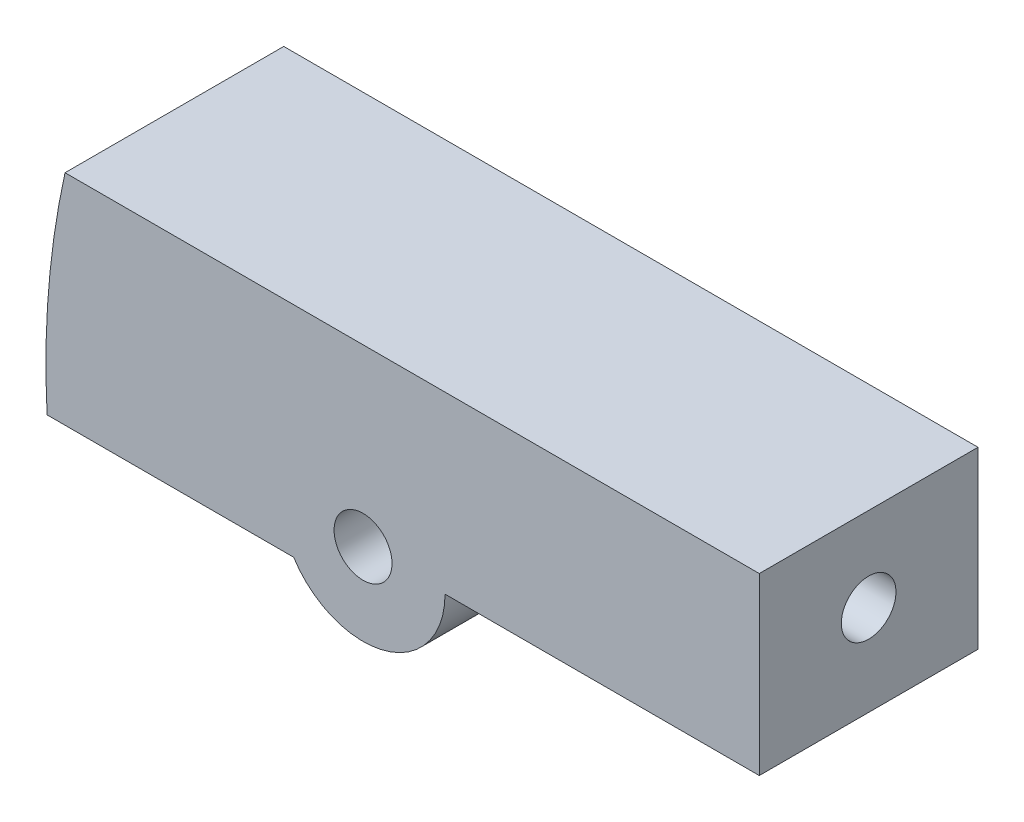
ISO-10303-21;
HEADER;
FILE_DESCRIPTION(('STEP AP214'),'2;1');
FILE_NAME('part.step','',(''),(''),'','','');
FILE_SCHEMA(('AUTOMOTIVE_DESIGN { 1 0 10303 214 1 1 1 1 }'));
ENDSEC;
DATA;
#1=APPLICATION_CONTEXT('core data for automotive mechanical design processes');
#2=APPLICATION_PROTOCOL_DEFINITION('international standard','automotive_design',2000,#1);
#3=PRODUCT_CONTEXT('',#1,'mechanical');
#4=PRODUCT('Part','Part','',(#3));
#5=PRODUCT_RELATED_PRODUCT_CATEGORY('part','',(#4));
#6=PRODUCT_DEFINITION_FORMATION('','',#4);
#7=PRODUCT_DEFINITION_CONTEXT('part definition',#1,'design');
#8=PRODUCT_DEFINITION('design','',#6,#7);
#9=PRODUCT_DEFINITION_SHAPE('','',#8);
#10=(LENGTH_UNIT() NAMED_UNIT(*) SI_UNIT(.MILLI.,.METRE.));
#11=(NAMED_UNIT(*) PLANE_ANGLE_UNIT() SI_UNIT($,.RADIAN.));
#12=(NAMED_UNIT(*) SI_UNIT($,.STERADIAN.) SOLID_ANGLE_UNIT());
#13=UNCERTAINTY_MEASURE_WITH_UNIT(LENGTH_MEASURE(1.E-05),#10,'distance_accuracy_value','');
#14=(GEOMETRIC_REPRESENTATION_CONTEXT(3) GLOBAL_UNCERTAINTY_ASSIGNED_CONTEXT((#13)) GLOBAL_UNIT_ASSIGNED_CONTEXT((#10,
#11,#12)) REPRESENTATION_CONTEXT('',''));
#15=CARTESIAN_POINT('',(0.,0.,0.));
#16=DIRECTION('',(0.,0.,1.));
#17=DIRECTION('',(1.,0.,0.));
#18=AXIS2_PLACEMENT_3D('',#15,#16,#17);
#19=CARTESIAN_POINT('',(0.,-4.00000000000001,10.));
#20=DIRECTION('',(0.,1.,0.));
#21=DIRECTION('',(0.,0.,1.));
#22=AXIS2_PLACEMENT_3D('',#19,#20,#21);
#23=PLANE('',#22);
#24=DIRECTION('',(0.,0.,-1.));
#25=VECTOR('',#24,1.);
#26=CARTESIAN_POINT('',(-73.8918128076447,-4.00000000000001,10.));
#27=LINE('',#26,#25);
#28=CARTESIAN_POINT('',(-73.8918128076447,-4.00000000000001,-10.));
#29=VERTEX_POINT('',#28);
#30=CARTESIAN_POINT('',(-73.8918128076447,-4.00000000000001,10.));
#31=VERTEX_POINT('',#30);
#32=EDGE_CURVE('E161',#29,#31,#27,.F.);
#33=ORIENTED_EDGE('',*,*,#32,.F.);
#34=DIRECTION('',(1.,0.,0.));
#35=VECTOR('',#34,1.);
#36=CARTESIAN_POINT('',(0.,-4.00000000000001,-10.));
#37=LINE('',#36,#35);
#38=CARTESIAN_POINT('',(-51.3442887702248,-4.00000000000001,-10.));
#39=VERTEX_POINT('',#38);
#40=EDGE_CURVE('E119',#29,#39,#37,.T.);
#41=ORIENTED_EDGE('',*,*,#40,.T.);
#42=DIRECTION('',(0.,0.,-1.));
#43=VECTOR('',#42,1.);
#44=CARTESIAN_POINT('',(-51.3442887702248,-4.00000000000001,10.));
#45=LINE('',#44,#43);
#46=CARTESIAN_POINT('',(-51.3442887702248,-4.00000000000001,10.));
#47=VERTEX_POINT('',#46);
#48=EDGE_CURVE('E11',#47,#39,#45,.T.);
#49=ORIENTED_EDGE('',*,*,#48,.F.);
#50=DIRECTION('',(1.,0.,0.));
#51=VECTOR('',#50,1.);
#52=CARTESIAN_POINT('',(0.,-4.00000000000001,10.));
#53=LINE('',#52,#51);
#54=EDGE_CURVE('E131',#31,#47,#53,.T.);
#55=ORIENTED_EDGE('',*,*,#54,.F.);
#56=EDGE_LOOP('',(#33,#41,#49,#55));
#57=FACE_BOUND('',#56,.T.);
#58=ADVANCED_FACE('F38',(#57),#23,.F.);
#59=CARTESIAN_POINT('',(0.,16.,10.));
#60=DIRECTION('',(0.,-1.,0.));
#61=DIRECTION('',(0.,0.,-1.));
#62=AXIS2_PLACEMENT_3D('',#59,#60,#61);
#63=PLANE('',#62);
#64=DIRECTION('',(-1.,0.,0.));
#65=VECTOR('',#64,1.);
#66=CARTESIAN_POINT('',(0.,16.,10.));
#67=LINE('',#66,#65);
#68=CARTESIAN_POINT('',(-8.7639577987509,16.,10.));
#69=VERTEX_POINT('',#68);
#70=CARTESIAN_POINT('',(-72.2495674727538,16.,10.));
#71=VERTEX_POINT('',#70);
#72=EDGE_CURVE('E104',#69,#71,#67,.T.);
#73=ORIENTED_EDGE('',*,*,#72,.F.);
#74=DIRECTION('',(0.,0.,-1.));
#75=VECTOR('',#74,1.);
#76=CARTESIAN_POINT('',(-8.7639577987509,16.,10.));
#77=LINE('',#76,#75);
#78=CARTESIAN_POINT('',(-8.7639577987509,16.,-10.));
#79=VERTEX_POINT('',#78);
#80=EDGE_CURVE('E91',#69,#79,#77,.T.);
#81=ORIENTED_EDGE('',*,*,#80,.T.);
#82=DIRECTION('',(-1.,0.,0.));
#83=VECTOR('',#82,1.);
#84=CARTESIAN_POINT('',(0.,16.,-10.));
#85=LINE('',#84,#83);
#86=CARTESIAN_POINT('',(-72.2495674727538,16.,-10.));
#87=VERTEX_POINT('',#86);
#88=EDGE_CURVE('E62',#79,#87,#85,.T.);
#89=ORIENTED_EDGE('',*,*,#88,.T.);
#90=DIRECTION('',(0.,0.,-1.));
#91=VECTOR('',#90,1.);
#92=CARTESIAN_POINT('',(-72.2495674727538,16.,10.));
#93=LINE('',#92,#91);
#94=EDGE_CURVE('E110',#71,#87,#93,.T.);
#95=ORIENTED_EDGE('',*,*,#94,.F.);
#96=EDGE_LOOP('',(#73,#81,#89,#95));
#97=FACE_BOUND('',#96,.T.);
#98=ADVANCED_FACE('F109',(#97),#63,.F.);
#99=CARTESIAN_POINT('',(0.,0.,10.));
#100=DIRECTION('',(0.,0.,1.));
#101=DIRECTION('',(1.,0.,0.));
#102=AXIS2_PLACEMENT_3D('',#99,#100,#101);
#103=PLANE('',#102);
#104=DIRECTION('',(0.,1.,0.));
#105=VECTOR('',#104,1.);
#106=CARTESIAN_POINT('',(-8.7639577987509,0.,10.));
#107=LINE('',#106,#105);
#108=CARTESIAN_POINT('',(-8.7639577987509,0.,10.));
#109=VERTEX_POINT('',#108);
#110=EDGE_CURVE('E54',#109,#69,#107,.T.);
#111=ORIENTED_EDGE('',*,*,#110,.T.);
#112=ORIENTED_EDGE('',*,*,#72,.T.);
#113=CARTESIAN_POINT('',(0.,0.,10.));
#114=DIRECTION('',(0.,0.,-1.));
#115=DIRECTION('',(-1.,0.,0.));
#116=AXIS2_PLACEMENT_3D('',#113,#114,#115);
#117=CIRCLE('',#116,74.);
#118=EDGE_CURVE('E140',#31,#71,#117,.T.);
#119=ORIENTED_EDGE('',*,*,#118,.F.);
#120=ORIENTED_EDGE('',*,*,#54,.T.);
#121=CARTESIAN_POINT('',(-45.,0.,10.));
#122=DIRECTION('',(0.,0.,1.));
#123=DIRECTION('',(1.,0.,0.));
#124=AXIS2_PLACEMENT_3D('',#121,#122,#123);
#125=CIRCLE('',#124,7.5);
#126=CARTESIAN_POINT('',(-37.5,0.,10.));
#127=VERTEX_POINT('',#126);
#128=EDGE_CURVE('E115',#47,#127,#125,.T.);
#129=ORIENTED_EDGE('',*,*,#128,.T.);
#130=DIRECTION('',(1.,0.,0.));
#131=VECTOR('',#130,1.);
#132=CARTESIAN_POINT('',(0.,0.,10.));
#133=LINE('',#132,#131);
#134=EDGE_CURVE('E107',#127,#109,#133,.T.);
#135=ORIENTED_EDGE('',*,*,#134,.T.);
#136=EDGE_LOOP('',(#111,#112,#119,#120,#129,#135));
#137=FACE_BOUND('',#136,.T.);
#138=CARTESIAN_POINT('',(-45.,0.,10.));
#139=DIRECTION('',(0.,0.,1.));
#140=DIRECTION('',(1.,0.,0.));
#141=AXIS2_PLACEMENT_3D('',#138,#139,#140);
#142=CIRCLE('',#141,2.65);
#143=CARTESIAN_POINT('',(-42.35,0.,10.));
#144=VERTEX_POINT('',#143);
#145=EDGE_CURVE('E111',#144,#144,#142,.T.);
#146=ORIENTED_EDGE('',*,*,#145,.F.);
#147=EDGE_LOOP('',(#146));
#148=FACE_BOUND('',#147,.T.);
#149=ADVANCED_FACE('F101',(#137,#148),#103,.T.);
#150=CARTESIAN_POINT('',(0.,0.,-10.));
#151=DIRECTION('',(0.,0.,1.));
#152=DIRECTION('',(1.,0.,0.));
#153=AXIS2_PLACEMENT_3D('',#150,#151,#152);
#154=PLANE('',#153);
#155=CARTESIAN_POINT('',(-45.,0.,-10.));
#156=DIRECTION('',(0.,0.,1.));
#157=DIRECTION('',(1.,0.,0.));
#158=AXIS2_PLACEMENT_3D('',#155,#156,#157);
#159=CIRCLE('',#158,2.65);
#160=CARTESIAN_POINT('',(-42.35,0.,-10.));
#161=VERTEX_POINT('',#160);
#162=EDGE_CURVE('E128',#161,#161,#159,.T.);
#163=ORIENTED_EDGE('',*,*,#162,.T.);
#164=EDGE_LOOP('',(#163));
#165=FACE_BOUND('',#164,.T.);
#166=ORIENTED_EDGE('',*,*,#88,.F.);
#167=DIRECTION('',(0.,1.,0.));
#168=VECTOR('',#167,1.);
#169=CARTESIAN_POINT('',(-8.7639577987509,0.,-10.));
#170=LINE('',#169,#168);
#171=CARTESIAN_POINT('',(-8.7639577987509,0.,-10.));
#172=VERTEX_POINT('',#171);
#173=EDGE_CURVE('E95',#172,#79,#170,.T.);
#174=ORIENTED_EDGE('',*,*,#173,.F.);
#175=DIRECTION('',(1.,0.,0.));
#176=VECTOR('',#175,1.);
#177=CARTESIAN_POINT('',(0.,0.,-10.));
#178=LINE('',#177,#176);
#179=CARTESIAN_POINT('',(-37.5,0.,-10.));
#180=VERTEX_POINT('',#179);
#181=EDGE_CURVE('E124',#180,#172,#178,.T.);
#182=ORIENTED_EDGE('',*,*,#181,.F.);
#183=CARTESIAN_POINT('',(-45.,0.,-10.));
#184=DIRECTION('',(0.,0.,1.));
#185=DIRECTION('',(1.,0.,0.));
#186=AXIS2_PLACEMENT_3D('',#183,#184,#185);
#187=CIRCLE('',#186,7.5);
#188=EDGE_CURVE('E121',#39,#180,#187,.T.);
#189=ORIENTED_EDGE('',*,*,#188,.F.);
#190=ORIENTED_EDGE('',*,*,#40,.F.);
#191=CARTESIAN_POINT('',(0.,0.,-10.));
#192=DIRECTION('',(0.,0.,-1.));
#193=DIRECTION('',(-1.,0.,0.));
#194=AXIS2_PLACEMENT_3D('',#191,#192,#193);
#195=CIRCLE('',#194,74.);
#196=EDGE_CURVE('E171',#29,#87,#195,.T.);
#197=ORIENTED_EDGE('',*,*,#196,.T.);
#198=EDGE_LOOP('',(#166,#174,#182,#189,#190,#197));
#199=FACE_BOUND('',#198,.T.);
#200=ADVANCED_FACE('F170',(#165,#199),#154,.F.);
#201=CARTESIAN_POINT('',(-70.2436043793756,8.3,0.));
#202=DIRECTION('',(-1.,0.,0.));
#203=DIRECTION('',(0.,0.,1.));
#204=AXIS2_PLACEMENT_3D('',#201,#202,#203);
#205=CONICAL_SURFACE('',#204,5.,0.463647609000806);
#206=CARTESIAN_POINT('',(-70.2436043793756,8.3,0.));
#207=DIRECTION('',(-1.,0.,0.));
#208=DIRECTION('',(0.,0.,1.));
#209=AXIS2_PLACEMENT_3D('',#206,#207,#208);
#210=CIRCLE('',#209,5.);
#211=CARTESIAN_POINT('',(-70.2436043793756,8.3,5.));
#212=VERTEX_POINT('',#211);
#213=EDGE_CURVE('E166',#212,#212,#210,.T.);
#214=ORIENTED_EDGE('',*,*,#213,.F.);
#215=EDGE_LOOP('',(#214));
#216=FACE_BOUND('',#215,.T.);
#217=CARTESIAN_POINT('',(-73.9208250030032,3.42222856590751,-4.79311329172754));
#218=CARTESIAN_POINT('',(-73.927455676223,3.27900552676786,-4.65209047552909));
#219=CARTESIAN_POINT('',(-73.9333700677521,3.14223725698298,-4.50447694520476));
#220=CARTESIAN_POINT('',(-73.9439469878067,2.88263622392718,-4.19731638967341));
#221=CARTESIAN_POINT('',(-73.9486089502586,2.75980977652413,-4.03776400985305));
#222=CARTESIAN_POINT('',(-73.956864140095,2.52895472577176,-3.70796102563179));
#223=CARTESIAN_POINT('',(-73.9604559756042,2.42094549224557,-3.53769683417333));
#224=CARTESIAN_POINT('',(-73.9667399778516,2.22068109353439,-3.18803952709168));
#225=CARTESIAN_POINT('',(-73.9694318026984,2.128431921695,-3.00864297206272));
#226=CARTESIAN_POINT('',(-73.9739037865618,1.9666252751813,-2.65583859145309));
#227=CARTESIAN_POINT('',(-73.9757366164715,1.89589468660634,-2.48296789741234));
#228=CARTESIAN_POINT('',(-73.9788805704622,1.76897271536259,-2.13189679329858));
#229=CARTESIAN_POINT('',(-73.9801915204285,1.71278618720946,-1.95369462577034));
#230=CARTESIAN_POINT('',(-73.9823827625387,1.61536819991884,-1.59342275704418));
#231=CARTESIAN_POINT('',(-73.9832634467708,1.57412313397626,-1.411356735353));
#232=CARTESIAN_POINT('',(-73.9846663141089,1.50674724357851,-1.0443796014143));
#233=CARTESIAN_POINT('',(-73.9851883643301,1.48062202205105,-0.859467460511191));
#234=CARTESIAN_POINT('',(-73.9859257422696,1.44331201948869,-0.484591952088412));
#235=CARTESIAN_POINT('',(-73.9861350572726,1.43242036860439,-0.294599343560892));
#236=CARTESIAN_POINT('',(-73.9862478895074,1.42658034055793,0.0857009679514436));
#237=CARTESIAN_POINT('',(-73.9861512923211,1.43163792877076,0.276008762217751));
#238=CARTESIAN_POINT('',(-73.9856428597659,1.45767613837094,0.655495297328398));
#239=CARTESIAN_POINT('',(-73.9852310851561,1.4786536907443,0.844674248704919));
#240=CARTESIAN_POINT('',(-73.9840541882086,1.53641109997477,1.22067505683643));
#241=CARTESIAN_POINT('',(-73.9832889354756,1.5731967879757,1.40749601759819));
#242=CARTESIAN_POINT('',(-73.9813349448679,1.66255350724914,1.77824032137923));
#243=CARTESIAN_POINT('',(-73.9801442626754,1.71519683557402,1.96214624372067));
#244=CARTESIAN_POINT('',(-73.9772473758999,1.83589588518588,2.3248988564165));
#245=CARTESIAN_POINT('',(-73.9755409788103,1.90395735939002,2.50374363023082));
#246=CARTESIAN_POINT('',(-73.9714982565647,2.05503008622673,2.85492916008061));
#247=CARTESIAN_POINT('',(-73.9691621836708,2.13803534763375,3.02727248928793));
#248=CARTESIAN_POINT('',(-73.9637268967619,2.31845747924975,3.36425124641934));
#249=CARTESIAN_POINT('',(-73.9606274048362,2.4158795925218,3.52888384133737));
#250=CARTESIAN_POINT('',(-73.9500365052037,2.7266860167672,4.00592257379688));
#251=CARTESIAN_POINT('',(-73.9412136787813,2.96033169157717,4.30545995353136));
#252=CARTESIAN_POINT('',(-73.9187982496538,3.47526251045289,4.85982471586212));
#253=CARTESIAN_POINT('',(-73.9052062468609,3.75654166042737,5.11465771575443));
#254=CARTESIAN_POINT('',(-73.8724793862087,4.35244571853446,5.56688257137147));
#255=CARTESIAN_POINT('',(-73.8534672774451,4.66624369830599,5.7653710229704));
#256=CARTESIAN_POINT('',(-73.8090499156357,5.32280111725325,6.1055859172673));
#257=CARTESIAN_POINT('',(-73.7836455142603,5.66555669425572,6.24731991507244));
#258=CARTESIAN_POINT('',(-73.7267662350315,6.3626800483997,6.46733347278033));
#259=CARTESIAN_POINT('',(-73.6954248449066,6.71667161299089,6.54684102915377));
#260=CARTESIAN_POINT('',(-73.6266831453436,7.43240953461221,6.64485904978969));
#261=CARTESIAN_POINT('',(-73.5892831467255,7.79415549299936,6.66337264213665));
#262=CARTESIAN_POINT('',(-73.5096082012769,8.51278071820004,6.63924104102747));
#263=CARTESIAN_POINT('',(-73.4673645500759,8.86967622509269,6.5969701331704));
#264=CARTESIAN_POINT('',(-73.3792982629063,9.57097508408251,6.45359335164503));
#265=CARTESIAN_POINT('',(-73.3334754379,9.9153777749505,6.35248436856386));
#266=CARTESIAN_POINT('',(-73.2396536474501,10.5862769636153,6.0932344415436));
#267=CARTESIAN_POINT('',(-73.1916358028826,10.9125239736766,5.93445520212143));
#268=CARTESIAN_POINT('',(-73.096248398103,11.5341892837999,5.56487770941509));
#269=CARTESIAN_POINT('',(-73.0488789038736,11.8296044660798,5.35407420256103));
#270=CARTESIAN_POINT('',(-72.9564326674587,12.3871051498477,4.88209555553649));
#271=CARTESIAN_POINT('',(-72.9114146260858,12.6484721511774,4.6200599229229));
#272=CARTESIAN_POINT('',(-72.8272538611699,13.1243916334226,4.05563166888233));
#273=CARTESIAN_POINT('',(-72.788111509735,13.3389411497701,3.75323649376884));
#274=CARTESIAN_POINT('',(-72.7177180758931,13.7175472426624,3.11296428710339));
#275=CARTESIAN_POINT('',(-72.6865577570959,13.8810273355176,2.77473610626913));
#276=CARTESIAN_POINT('',(-72.6347334007632,14.1497117985555,2.07512110816519));
#277=CARTESIAN_POINT('',(-72.6140692360589,14.254916874785,1.71373457153601));
#278=CARTESIAN_POINT('',(-72.5846484453515,14.4039802348677,0.978414933793614));
#279=CARTESIAN_POINT('',(-72.5758802520301,14.4478981139104,0.604494383567873));
#280=CARTESIAN_POINT('',(-72.5708185696173,14.4733020939769,-0.145541250870023));
#281=CARTESIAN_POINT('',(-72.5745248187789,14.4547895049579,-0.521656288870685));
#282=CARTESIAN_POINT('',(-72.5941194025391,14.3560545529598,-1.26400972526993));
#283=CARTESIAN_POINT('',(-72.6099647915923,14.2760497324001,-1.63027824028581));
#284=CARTESIAN_POINT('',(-72.6527152444702,14.0568602652551,-2.3439911566334));
#285=CARTESIAN_POINT('',(-72.6796205654705,13.9176742425327,-2.69143512002702));
#286=CARTESIAN_POINT('',(-72.7427843503267,13.5836738749838,-3.35849151272348));
#287=CARTESIAN_POINT('',(-72.7790642794538,13.3887317530891,-3.67803778736043));
#288=CARTESIAN_POINT('',(-72.858676161744,12.9484768928227,-4.2796050010972));
#289=CARTESIAN_POINT('',(-72.9020083965779,12.7031621424544,-4.56162444054869));
#290=CARTESIAN_POINT('',(-72.9703324776783,12.3024018989965,-4.95055796340287));
#291=CARTESIAN_POINT('',(-72.9937117425104,12.1630376136135,-5.0747345795364));
#292=CARTESIAN_POINT('',(-73.0412320602965,11.874333052427,-5.31069796275349));
#293=CARTESIAN_POINT('',(-73.0653728224116,11.724996561545,-5.42248938824177));
#294=CARTESIAN_POINT('',(-73.1140854245178,11.4173020857442,-5.63288258059459));
#295=CARTESIAN_POINT('',(-73.138657420766,11.2589407819559,-5.73147944995433));
#296=CARTESIAN_POINT('',(-73.1878810983889,10.9343943665452,-5.91465048850972));
#297=CARTESIAN_POINT('',(-73.2125327448917,10.7682123349095,-5.9992301196601));
#298=CARTESIAN_POINT('',(-73.2614278836494,10.4303456188821,-6.15318053265259));
#299=CARTESIAN_POINT('',(-73.2856730331787,10.2587086650945,-6.22265554009587));
#300=CARTESIAN_POINT('',(-73.3336284019388,9.91009017586471,-6.34656248453261));
#301=CARTESIAN_POINT('',(-73.3573388283053,9.73311077428739,-6.40100034169141));
#302=CARTESIAN_POINT('',(-73.403968997886,9.37496409398067,-6.49441089301656));
#303=CARTESIAN_POINT('',(-73.4268885388917,9.19379576373877,-6.53337965850721));
#304=CARTESIAN_POINT('',(-73.4716797963158,8.82870742185639,-6.59546124092518));
#305=CARTESIAN_POINT('',(-73.4935519278274,8.64478853883585,-6.61858038831752));
#306=CARTESIAN_POINT('',(-73.5356730705991,8.27877512809782,-6.64848310838499));
#307=CARTESIAN_POINT('',(-73.5559440064084,8.09670619322032,-6.65554944981485));
#308=CARTESIAN_POINT('',(-73.5951161441694,7.73255457812772,-6.65407878724434));
#309=CARTESIAN_POINT('',(-73.6140178835077,7.55047193169169,-6.64554793975382));
#310=CARTESIAN_POINT('',(-73.650348584391,7.18745088062327,-6.61291020229587));
#311=CARTESIAN_POINT('',(-73.6677766766478,7.00651320881555,-6.58879419030522));
#312=CARTESIAN_POINT('',(-73.7010583888912,6.64729400492571,-6.52514519860433));
#313=CARTESIAN_POINT('',(-73.7169126062997,6.46901148699348,-6.48561809703158));
#314=CARTESIAN_POINT('',(-73.746808013733,6.11872486385843,-6.3920678154213));
#315=CARTESIAN_POINT('',(-73.7608707259052,5.94666856041678,-6.338246814265));
#316=CARTESIAN_POINT('',(-73.7874186830245,5.60765065366803,-6.21629925080905));
#317=CARTESIAN_POINT('',(-73.7999045148146,5.44068717269445,-6.14817803567308));
#318=CARTESIAN_POINT('',(-73.8233204248888,5.11314903604227,-5.9982101927412));
#319=CARTESIAN_POINT('',(-73.8342521705054,4.95256766854598,-5.91637848311146));
#320=CARTESIAN_POINT('',(-73.8546307477812,4.63877542547184,-5.7395855544747));
#321=CARTESIAN_POINT('',(-73.8640780257665,4.48556234416593,-5.64462829805069));
#322=CARTESIAN_POINT('',(-73.8824098230116,4.17327881827797,-5.43261702377971));
#323=CARTESIAN_POINT('',(-73.8911548151189,4.01504260259046,-5.31431943403066));
#324=CARTESIAN_POINT('',(-73.9071054271562,3.70986966004563,-5.06384037104379));
#325=CARTESIAN_POINT('',(-73.9143108765508,3.56293418612595,-4.93165736213233));
#326=CARTESIAN_POINT('',(-73.9208250030032,3.42222856590751,-4.79311329172754));
#327=B_SPLINE_CURVE_WITH_KNOTS('',3,(#217,#218,#219,#220,#221,#222,#223,#224,#225,#226,#227,
#228,#229,#230,#231,#232,#233,#234,#235,#236,#237,#238,#239,#240,#241,#242,#243,#244,#245,#246,
#247,#248,#249,#250,#251,#252,#253,#254,#255,#256,#257,#258,#259,#260,#261,#262,#263,#264,#265,
#266,#267,#268,#269,#270,#271,#272,#273,#274,#275,#276,#277,#278,#279,#280,#281,#282,#283,#284,
#285,#286,#287,#288,#289,#290,#291,#292,#293,#294,#295,#296,#297,#298,#299,#300,#301,#302,#303,
#304,#305,#306,#307,#308,#309,#310,#311,#312,#313,#314,#315,#316,#317,#318,#319,#320,#321,#322,
#323,#324,#325,#326),.UNSPECIFIED.,.T.,.F.,(4,2,2,2,2,2,2,2,2,2,2,2,2,2,2,2,2,2,2,2,2,2,2,2,2,2,
2,2,2,2,2,2,2,2,2,2,2,2,2,2,2,2,2,2,2,2,2,2,2,2,2,2,2,2,4),(0.,0.603115447660746,
1.20650303490443,1.81067203430376,2.41507028230888,2.9748041951209,3.53472469567961,
4.09413400154751,4.65375047398556,5.22399370868197,5.79445025249667,6.36479685294011,
6.93535401784861,7.50855284337367,8.08196589782118,8.65514957083051,9.22854221161559,
10.3624588390111,11.4962328827293,12.6061318338987,13.7158829870567,14.8031392983234,
15.8903398486212,16.9708744691277,18.0514661977807,19.144401774417,20.2374477642292,
21.3507347411872,22.4640921930506,23.5895977528297,24.7150896759435,25.8394864151335,
26.9638595616383,28.0842731939893,29.2047128806829,30.3277411570705,31.4508142984724,
32.0146184031959,32.5782097208104,33.1420096532796,33.705589376378,34.2651473036683,
34.8244846165283,35.3839638931968,35.943219578948,36.4925450056936,37.0416536499586,
37.5910839798816,38.1403049493666,38.6821369174916,39.2237666424951,39.7648108114453,
40.3056919952748,40.8981409434037,41.4906554832165),.UNSPECIFIED.);
#328=CARTESIAN_POINT('',(-73.9208250030032,3.42222856590751,-4.79311329172754));
#329=VERTEX_POINT('',#328);
#330=EDGE_CURVE('E133',#329,#329,#327,.T.);
#331=ORIENTED_EDGE('',*,*,#330,.T.);
#332=EDGE_LOOP('',(#331));
#333=FACE_BOUND('',#332,.T.);
#334=ADVANCED_FACE('F141',(#216,#333),#205,.F.);
#335=CARTESIAN_POINT('',(-45.,0.,10.));
#336=DIRECTION('',(0.,0.,-1.));
#337=DIRECTION('',(-1.,0.,0.));
#338=AXIS2_PLACEMENT_3D('',#335,#336,#337);
#339=CYLINDRICAL_SURFACE('',#338,7.5);
#340=ORIENTED_EDGE('',*,*,#188,.T.);
#341=DIRECTION('',(0.,0.,-1.));
#342=VECTOR('',#341,1.);
#343=CARTESIAN_POINT('',(-37.5,0.,10.));
#344=LINE('',#343,#342);
#345=EDGE_CURVE('E46',#127,#180,#344,.T.);
#346=ORIENTED_EDGE('',*,*,#345,.F.);
#347=ORIENTED_EDGE('',*,*,#128,.F.);
#348=ORIENTED_EDGE('',*,*,#48,.T.);
#349=EDGE_LOOP('',(#340,#346,#347,#348));
#350=FACE_BOUND('',#349,.T.);
#351=ADVANCED_FACE('F176',(#350),#339,.T.);
#352=CARTESIAN_POINT('',(0.,0.,10.));
#353=DIRECTION('',(0.,1.,0.));
#354=DIRECTION('',(-1.,0.,0.));
#355=AXIS2_PLACEMENT_3D('',#352,#353,#354);
#356=PLANE('',#355);
#357=ORIENTED_EDGE('',*,*,#181,.T.);
#358=DIRECTION('',(0.,0.,-1.));
#359=VECTOR('',#358,1.);
#360=CARTESIAN_POINT('',(-8.7639577987509,0.,10.));
#361=LINE('',#360,#359);
#362=EDGE_CURVE('E97',#109,#172,#361,.T.);
#363=ORIENTED_EDGE('',*,*,#362,.F.);
#364=ORIENTED_EDGE('',*,*,#134,.F.);
#365=ORIENTED_EDGE('',*,*,#345,.T.);
#366=EDGE_LOOP('',(#357,#363,#364,#365));
#367=FACE_BOUND('',#366,.T.);
#368=ADVANCED_FACE('F197',(#367),#356,.F.);
#369=CARTESIAN_POINT('',(-45.,0.,10.));
#370=DIRECTION('',(0.,0.,-1.));
#371=DIRECTION('',(-1.,0.,0.));
#372=AXIS2_PLACEMENT_3D('',#369,#370,#371);
#373=CYLINDRICAL_SURFACE('',#372,2.65);
#374=ORIENTED_EDGE('',*,*,#145,.T.);
#375=EDGE_LOOP('',(#374));
#376=FACE_BOUND('',#375,.T.);
#377=ORIENTED_EDGE('',*,*,#162,.F.);
#378=EDGE_LOOP('',(#377));
#379=FACE_BOUND('',#378,.T.);
#380=ADVANCED_FACE('F199',(#376,#379),#373,.F.);
#381=CARTESIAN_POINT('',(-75.2436043793757,8.3,0.));
#382=DIRECTION('',(-1.,0.,0.));
#383=DIRECTION('',(0.,0.,1.));
#384=AXIS2_PLACEMENT_3D('',#381,#382,#383);
#385=CYLINDRICAL_SURFACE('',#384,2.50000000000002);
#386=CARTESIAN_POINT('',(-8.7639577987509,8.3,0.));
#387=DIRECTION('',(-1.,0.,0.));
#388=DIRECTION('',(0.,0.,1.));
#389=AXIS2_PLACEMENT_3D('',#386,#387,#388);
#390=CIRCLE('',#389,2.50000000000002);
#391=CARTESIAN_POINT('',(-8.7639577987509,8.3,2.50000000000002));
#392=VERTEX_POINT('',#391);
#393=EDGE_CURVE('E41',#392,#392,#390,.F.);
#394=ORIENTED_EDGE('',*,*,#393,.T.);
#395=EDGE_LOOP('',(#394));
#396=FACE_BOUND('',#395,.T.);
#397=CARTESIAN_POINT('',(-23.7436043793757,8.3,0.));
#398=DIRECTION('',(-1.,0.,0.));
#399=DIRECTION('',(0.,0.,1.));
#400=AXIS2_PLACEMENT_3D('',#397,#398,#399);
#401=CIRCLE('',#400,2.50000000000002);
#402=CARTESIAN_POINT('',(-23.7436043793757,8.3,2.50000000000002));
#403=VERTEX_POINT('',#402);
#404=EDGE_CURVE('E122',#403,#403,#401,.T.);
#405=ORIENTED_EDGE('',*,*,#404,.T.);
#406=EDGE_LOOP('',(#405));
#407=FACE_BOUND('',#406,.T.);
#408=ADVANCED_FACE('F205',(#396,#407),#385,.F.);
#409=CARTESIAN_POINT('',(-25.2436043793757,8.3,0.));
#410=DIRECTION('',(-1.,0.,0.));
#411=DIRECTION('',(0.,0.,1.));
#412=AXIS2_PLACEMENT_3D('',#409,#410,#411);
#413=CONICAL_SURFACE('',#412,4.00000000000002,0.785398163397451);
#414=ORIENTED_EDGE('',*,*,#404,.F.);
#415=EDGE_LOOP('',(#414));
#416=FACE_BOUND('',#415,.T.);
#417=CARTESIAN_POINT('',(-25.2436043793757,8.3,0.));
#418=DIRECTION('',(-1.,0.,0.));
#419=DIRECTION('',(0.,0.,1.));
#420=AXIS2_PLACEMENT_3D('',#417,#418,#419);
#421=CIRCLE('',#420,4.00000000000002);
#422=CARTESIAN_POINT('',(-25.2436043793757,8.3,4.00000000000002));
#423=VERTEX_POINT('',#422);
#424=EDGE_CURVE('E181',#423,#423,#421,.T.);
#425=ORIENTED_EDGE('',*,*,#424,.T.);
#426=EDGE_LOOP('',(#425));
#427=FACE_BOUND('',#426,.T.);
#428=ADVANCED_FACE('F216',(#416,#427),#413,.F.);
#429=CARTESIAN_POINT('',(-75.2436043793757,8.3,0.));
#430=DIRECTION('',(-1.,0.,0.));
#431=DIRECTION('',(0.,0.,1.));
#432=AXIS2_PLACEMENT_3D('',#429,#430,#431);
#433=CYLINDRICAL_SURFACE('',#432,4.00000000000002);
#434=ORIENTED_EDGE('',*,*,#424,.F.);
#435=EDGE_LOOP('',(#434));
#436=FACE_BOUND('',#435,.T.);
#437=CARTESIAN_POINT('',(-48.2436043793757,8.3,0.));
#438=DIRECTION('',(-1.,0.,0.));
#439=DIRECTION('',(0.,0.,1.));
#440=AXIS2_PLACEMENT_3D('',#437,#438,#439);
#441=CIRCLE('',#440,4.00000000000002);
#442=CARTESIAN_POINT('',(-48.2436043793757,8.3,4.00000000000002));
#443=VERTEX_POINT('',#442);
#444=EDGE_CURVE('E184',#443,#443,#441,.T.);
#445=ORIENTED_EDGE('',*,*,#444,.T.);
#446=EDGE_LOOP('',(#445));
#447=FACE_BOUND('',#446,.T.);
#448=ADVANCED_FACE('F220',(#436,#447),#433,.F.);
#449=CARTESIAN_POINT('',(-49.2436043793757,8.3,0.));
#450=DIRECTION('',(-1.,0.,0.));
#451=DIRECTION('',(0.,0.,1.));
#452=AXIS2_PLACEMENT_3D('',#449,#450,#451);
#453=CONICAL_SURFACE('',#452,5.,0.785398163397442);
#454=ORIENTED_EDGE('',*,*,#444,.F.);
#455=EDGE_LOOP('',(#454));
#456=FACE_BOUND('',#455,.T.);
#457=CARTESIAN_POINT('',(-49.2436043793757,8.3,0.));
#458=DIRECTION('',(-1.,0.,0.));
#459=DIRECTION('',(0.,0.,1.));
#460=AXIS2_PLACEMENT_3D('',#457,#458,#459);
#461=CIRCLE('',#460,5.);
#462=CARTESIAN_POINT('',(-49.2436043793757,8.3,5.));
#463=VERTEX_POINT('',#462);
#464=EDGE_CURVE('E187',#463,#463,#461,.T.);
#465=ORIENTED_EDGE('',*,*,#464,.T.);
#466=EDGE_LOOP('',(#465));
#467=FACE_BOUND('',#466,.T.);
#468=ADVANCED_FACE('F224',(#456,#467),#453,.F.);
#469=CARTESIAN_POINT('',(-75.2436043793757,8.3,0.));
#470=DIRECTION('',(-1.,0.,0.));
#471=DIRECTION('',(0.,0.,1.));
#472=AXIS2_PLACEMENT_3D('',#469,#470,#471);
#473=CYLINDRICAL_SURFACE('',#472,5.);
#474=ORIENTED_EDGE('',*,*,#213,.T.);
#475=EDGE_LOOP('',(#474));
#476=FACE_BOUND('',#475,.T.);
#477=ORIENTED_EDGE('',*,*,#464,.F.);
#478=EDGE_LOOP('',(#477));
#479=FACE_BOUND('',#478,.T.);
#480=ADVANCED_FACE('F148',(#476,#479),#473,.F.);
#481=CARTESIAN_POINT('',(0.,0.,10.));
#482=DIRECTION('',(0.,0.,-1.));
#483=DIRECTION('',(-1.,0.,0.));
#484=AXIS2_PLACEMENT_3D('',#481,#482,#483);
#485=CYLINDRICAL_SURFACE('',#484,74.);
#486=ORIENTED_EDGE('',*,*,#330,.F.);
#487=EDGE_LOOP('',(#486));
#488=FACE_BOUND('',#487,.T.);
#489=ORIENTED_EDGE('',*,*,#32,.T.);
#490=ORIENTED_EDGE('',*,*,#118,.T.);
#491=ORIENTED_EDGE('',*,*,#94,.T.);
#492=ORIENTED_EDGE('',*,*,#196,.F.);
#493=EDGE_LOOP('',(#489,#490,#491,#492));
#494=FACE_BOUND('',#493,.T.);
#495=ADVANCED_FACE('F144',(#488,#494),#485,.T.);
#496=CARTESIAN_POINT('',(-8.7639577987509,0.,10.));
#497=DIRECTION('',(-1.,0.,0.));
#498=DIRECTION('',(0.,0.,1.));
#499=AXIS2_PLACEMENT_3D('',#496,#497,#498);
#500=PLANE('',#499);
#501=ORIENTED_EDGE('',*,*,#173,.T.);
#502=ORIENTED_EDGE('',*,*,#80,.F.);
#503=ORIENTED_EDGE('',*,*,#110,.F.);
#504=ORIENTED_EDGE('',*,*,#362,.T.);
#505=EDGE_LOOP('',(#501,#502,#503,#504));
#506=FACE_BOUND('',#505,.T.);
#507=ORIENTED_EDGE('',*,*,#393,.F.);
#508=EDGE_LOOP('',(#507));
#509=FACE_BOUND('',#508,.T.);
#510=ADVANCED_FACE('F92',(#506,#509),#500,.F.);
#511=CLOSED_SHELL('',(#58,#98,#149,#200,#334,#351,#368,#380,#408,#428,#448,#468,#480,#495,#510));
#512=MANIFOLD_SOLID_BREP('B2',#511);
#513=ADVANCED_BREP_SHAPE_REPRESENTATION('',(#18,#512),#14);
#514=SHAPE_DEFINITION_REPRESENTATION(#9,#513);
ENDSEC;
END-ISO-10303-21;
